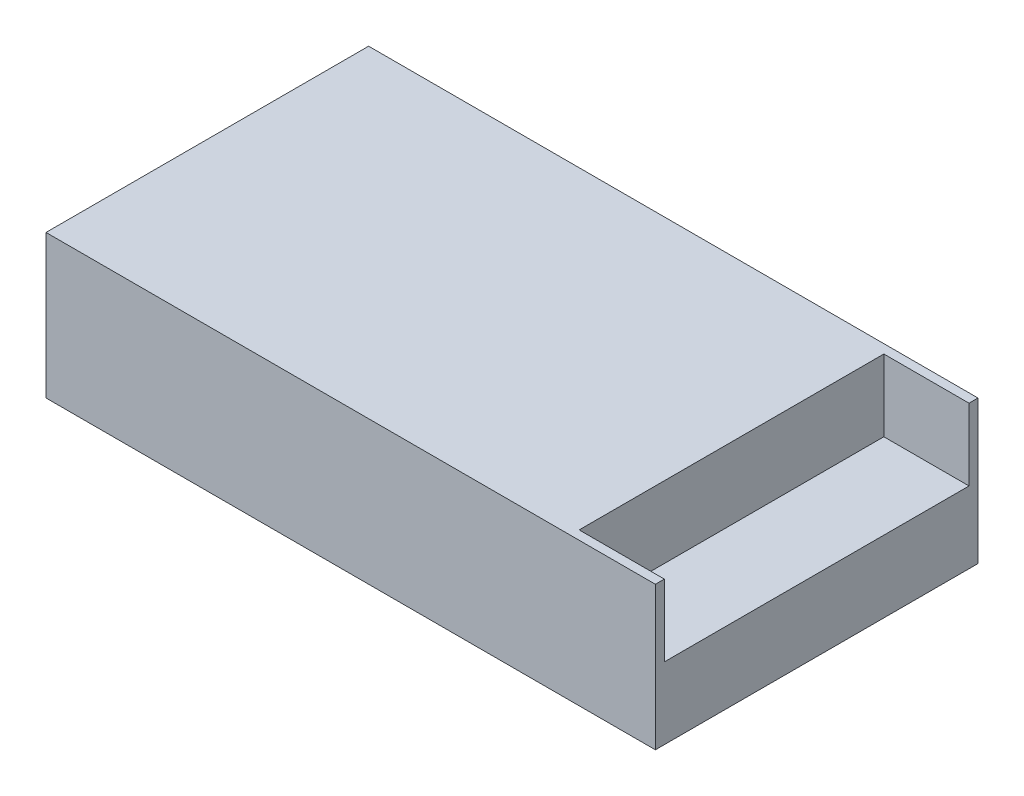
ISO-10303-21;
HEADER;
FILE_DESCRIPTION(('STEP AP214'),'2;1');
FILE_NAME('part.step','',(''),(''),'','','');
FILE_SCHEMA(('AUTOMOTIVE_DESIGN { 1 0 10303 214 1 1 1 1 }'));
ENDSEC;
DATA;
#1=APPLICATION_CONTEXT('core data for automotive mechanical design processes');
#2=APPLICATION_PROTOCOL_DEFINITION('international standard','automotive_design',2000,#1);
#3=PRODUCT_CONTEXT('',#1,'mechanical');
#4=PRODUCT('Part','Part','',(#3));
#5=PRODUCT_RELATED_PRODUCT_CATEGORY('part','',(#4));
#6=PRODUCT_DEFINITION_FORMATION('','',#4);
#7=PRODUCT_DEFINITION_CONTEXT('part definition',#1,'design');
#8=PRODUCT_DEFINITION('design','',#6,#7);
#9=PRODUCT_DEFINITION_SHAPE('','',#8);
#10=(LENGTH_UNIT() NAMED_UNIT(*) SI_UNIT(.MILLI.,.METRE.));
#11=(NAMED_UNIT(*) PLANE_ANGLE_UNIT() SI_UNIT($,.RADIAN.));
#12=(NAMED_UNIT(*) SI_UNIT($,.STERADIAN.) SOLID_ANGLE_UNIT());
#13=UNCERTAINTY_MEASURE_WITH_UNIT(LENGTH_MEASURE(1.E-05),#10,'distance_accuracy_value','');
#14=(GEOMETRIC_REPRESENTATION_CONTEXT(3) GLOBAL_UNCERTAINTY_ASSIGNED_CONTEXT((#13)) GLOBAL_UNIT_ASSIGNED_CONTEXT((#10,
#11,#12)) REPRESENTATION_CONTEXT('',''));
#15=CARTESIAN_POINT('',(0.,0.,0.));
#16=DIRECTION('',(0.,0.,1.));
#17=DIRECTION('',(1.,0.,0.));
#18=AXIS2_PLACEMENT_3D('',#15,#16,#17);
#19=CARTESIAN_POINT('',(0.,50.8,0.));
#20=DIRECTION('',(1.,0.,0.));
#21=DIRECTION('',(0.,0.,-1.));
#22=AXIS2_PLACEMENT_3D('',#19,#20,#21);
#23=PLANE('',#22);
#24=DIRECTION('',(0.,0.,1.));
#25=VECTOR('',#24,1.);
#26=CARTESIAN_POINT('',(0.,0.,0.));
#27=LINE('',#26,#25);
#28=CARTESIAN_POINT('',(0.,0.,-114.3));
#29=VERTEX_POINT('',#28);
#30=CARTESIAN_POINT('',(0.,0.,0.));
#31=VERTEX_POINT('',#30);
#32=EDGE_CURVE('E158',#29,#31,#27,.T.);
#33=ORIENTED_EDGE('',*,*,#32,.T.);
#34=DIRECTION('',(0.,-1.,0.));
#35=VECTOR('',#34,1.);
#36=CARTESIAN_POINT('',(0.,50.8,0.));
#37=LINE('',#36,#35);
#38=CARTESIAN_POINT('',(0.,50.8,0.));
#39=VERTEX_POINT('',#38);
#40=EDGE_CURVE('E11',#39,#31,#37,.T.);
#41=ORIENTED_EDGE('',*,*,#40,.F.);
#42=DIRECTION('',(0.,0.,1.));
#43=VECTOR('',#42,1.);
#44=CARTESIAN_POINT('',(0.,50.8,0.));
#45=LINE('',#44,#43);
#46=CARTESIAN_POINT('',(0.,50.8,-114.3));
#47=VERTEX_POINT('',#46);
#48=EDGE_CURVE('E146',#47,#39,#45,.T.);
#49=ORIENTED_EDGE('',*,*,#48,.F.);
#50=DIRECTION('',(0.,-1.,0.));
#51=VECTOR('',#50,1.);
#52=CARTESIAN_POINT('',(0.,50.8,-114.3));
#53=LINE('',#52,#51);
#54=EDGE_CURVE('E157',#47,#29,#53,.T.);
#55=ORIENTED_EDGE('',*,*,#54,.T.);
#56=EDGE_LOOP('',(#33,#41,#49,#55));
#57=FACE_BOUND('',#56,.T.);
#58=ADVANCED_FACE('F39',(#57),#23,.F.);
#59=CARTESIAN_POINT('',(0.,50.8,0.));
#60=DIRECTION('',(0.,0.,-1.));
#61=DIRECTION('',(-1.,0.,0.));
#62=AXIS2_PLACEMENT_3D('',#59,#60,#61);
#63=PLANE('',#62);
#64=DIRECTION('',(1.,0.,0.));
#65=VECTOR('',#64,1.);
#66=CARTESIAN_POINT('',(0.,0.,0.));
#67=LINE('',#66,#65);
#68=CARTESIAN_POINT('',(215.9,0.,0.));
#69=VERTEX_POINT('',#68);
#70=EDGE_CURVE('E162',#31,#69,#67,.T.);
#71=ORIENTED_EDGE('',*,*,#70,.T.);
#72=DIRECTION('',(0.,-1.,0.));
#73=VECTOR('',#72,1.);
#74=CARTESIAN_POINT('',(215.9,50.8,0.));
#75=LINE('',#74,#73);
#76=CARTESIAN_POINT('',(215.9,50.8,0.));
#77=VERTEX_POINT('',#76);
#78=EDGE_CURVE('E47',#77,#69,#75,.T.);
#79=ORIENTED_EDGE('',*,*,#78,.F.);
#80=DIRECTION('',(1.,0.,0.));
#81=VECTOR('',#80,1.);
#82=CARTESIAN_POINT('',(0.,50.8,0.));
#83=LINE('',#82,#81);
#84=EDGE_CURVE('E91',#39,#77,#83,.T.);
#85=ORIENTED_EDGE('',*,*,#84,.F.);
#86=ORIENTED_EDGE('',*,*,#40,.T.);
#87=EDGE_LOOP('',(#71,#79,#85,#86));
#88=FACE_BOUND('',#87,.T.);
#89=ADVANCED_FACE('F194',(#88),#63,.F.);
#90=CARTESIAN_POINT('',(215.9,50.8,0.));
#91=DIRECTION('',(-1.,0.,0.));
#92=DIRECTION('',(0.,0.,1.));
#93=AXIS2_PLACEMENT_3D('',#90,#91,#92);
#94=PLANE('',#93);
#95=DIRECTION('',(0.,0.,-1.));
#96=VECTOR('',#95,1.);
#97=CARTESIAN_POINT('',(215.9,25.4,-111.125));
#98=LINE('',#97,#96);
#99=CARTESIAN_POINT('',(215.9,25.4,-3.175));
#100=VERTEX_POINT('',#99);
#101=CARTESIAN_POINT('',(215.9,25.4,-111.125));
#102=VERTEX_POINT('',#101);
#103=EDGE_CURVE('E121',#100,#102,#98,.T.);
#104=ORIENTED_EDGE('',*,*,#103,.F.);
#105=DIRECTION('',(0.,1.,0.));
#106=VECTOR('',#105,1.);
#107=CARTESIAN_POINT('',(215.9,25.4,-3.175));
#108=LINE('',#107,#106);
#109=CARTESIAN_POINT('',(215.9,50.8,-3.175));
#110=VERTEX_POINT('',#109);
#111=EDGE_CURVE('E163',#100,#110,#108,.T.);
#112=ORIENTED_EDGE('',*,*,#111,.T.);
#113=DIRECTION('',(0.,0.,-1.));
#114=VECTOR('',#113,1.);
#115=CARTESIAN_POINT('',(215.9,50.8,0.));
#116=LINE('',#115,#114);
#117=EDGE_CURVE('E151',#77,#110,#116,.T.);
#118=ORIENTED_EDGE('',*,*,#117,.F.);
#119=ORIENTED_EDGE('',*,*,#78,.T.);
#120=DIRECTION('',(0.,0.,-1.));
#121=VECTOR('',#120,1.);
#122=CARTESIAN_POINT('',(215.9,0.,0.));
#123=LINE('',#122,#121);
#124=CARTESIAN_POINT('',(215.9,0.,-114.3));
#125=VERTEX_POINT('',#124);
#126=EDGE_CURVE('E166',#69,#125,#123,.T.);
#127=ORIENTED_EDGE('',*,*,#126,.T.);
#128=DIRECTION('',(0.,-1.,0.));
#129=VECTOR('',#128,1.);
#130=CARTESIAN_POINT('',(215.9,50.8,-114.3));
#131=LINE('',#130,#129);
#132=CARTESIAN_POINT('',(215.9,50.8,-114.3));
#133=VERTEX_POINT('',#132);
#134=EDGE_CURVE('E173',#133,#125,#131,.T.);
#135=ORIENTED_EDGE('',*,*,#134,.F.);
#136=CARTESIAN_POINT('',(215.9,50.8,-111.125));
#137=VERTEX_POINT('',#136);
#138=EDGE_CURVE('E136',#137,#133,#116,.T.);
#139=ORIENTED_EDGE('',*,*,#138,.F.);
#140=DIRECTION('',(0.,1.,0.));
#141=VECTOR('',#140,1.);
#142=CARTESIAN_POINT('',(215.9,25.4,-111.125));
#143=LINE('',#142,#141);
#144=EDGE_CURVE('E54',#102,#137,#143,.T.);
#145=ORIENTED_EDGE('',*,*,#144,.F.);
#146=EDGE_LOOP('',(#104,#112,#118,#119,#127,#135,#139,#145));
#147=FACE_BOUND('',#146,.T.);
#148=ADVANCED_FACE('F134',(#147),#94,.F.);
#149=CARTESIAN_POINT('',(0.,50.8,-114.3));
#150=DIRECTION('',(0.,0.,1.));
#151=DIRECTION('',(1.,0.,0.));
#152=AXIS2_PLACEMENT_3D('',#149,#150,#151);
#153=PLANE('',#152);
#154=DIRECTION('',(-1.,0.,0.));
#155=VECTOR('',#154,1.);
#156=CARTESIAN_POINT('',(0.,0.,-114.3));
#157=LINE('',#156,#155);
#158=EDGE_CURVE('E84',#125,#29,#157,.T.);
#159=ORIENTED_EDGE('',*,*,#158,.T.);
#160=ORIENTED_EDGE('',*,*,#54,.F.);
#161=DIRECTION('',(-1.,0.,0.));
#162=VECTOR('',#161,1.);
#163=CARTESIAN_POINT('',(0.,50.8,-114.3));
#164=LINE('',#163,#162);
#165=EDGE_CURVE('E63',#133,#47,#164,.T.);
#166=ORIENTED_EDGE('',*,*,#165,.F.);
#167=ORIENTED_EDGE('',*,*,#134,.T.);
#168=EDGE_LOOP('',(#159,#160,#166,#167));
#169=FACE_BOUND('',#168,.T.);
#170=ADVANCED_FACE('F185',(#169),#153,.F.);
#171=CARTESIAN_POINT('',(0.,50.8,0.));
#172=DIRECTION('',(0.,-1.,0.));
#173=DIRECTION('',(0.,0.,-1.));
#174=AXIS2_PLACEMENT_3D('',#171,#172,#173);
#175=PLANE('',#174);
#176=ORIENTED_EDGE('',*,*,#117,.T.);
#177=DIRECTION('',(1.,0.,0.));
#178=VECTOR('',#177,1.);
#179=CARTESIAN_POINT('',(215.9,50.8,-3.175));
#180=LINE('',#179,#178);
#181=CARTESIAN_POINT('',(185.71892836664,50.8,-3.175));
#182=VERTEX_POINT('',#181);
#183=EDGE_CURVE('E131',#182,#110,#180,.T.);
#184=ORIENTED_EDGE('',*,*,#183,.F.);
#185=DIRECTION('',(0.,0.,1.));
#186=VECTOR('',#185,1.);
#187=CARTESIAN_POINT('',(185.71892836664,50.8,-111.125));
#188=LINE('',#187,#186);
#189=CARTESIAN_POINT('',(185.71892836664,50.8,-111.125));
#190=VERTEX_POINT('',#189);
#191=EDGE_CURVE('E261',#190,#182,#188,.T.);
#192=ORIENTED_EDGE('',*,*,#191,.F.);
#193=DIRECTION('',(-1.,0.,0.));
#194=VECTOR('',#193,1.);
#195=CARTESIAN_POINT('',(215.9,50.8,-111.125));
#196=LINE('',#195,#194);
#197=EDGE_CURVE('E264',#137,#190,#196,.T.);
#198=ORIENTED_EDGE('',*,*,#197,.F.);
#199=ORIENTED_EDGE('',*,*,#138,.T.);
#200=ORIENTED_EDGE('',*,*,#165,.T.);
#201=ORIENTED_EDGE('',*,*,#48,.T.);
#202=ORIENTED_EDGE('',*,*,#84,.T.);
#203=EDGE_LOOP('',(#176,#184,#192,#198,#199,#200,#201,#202));
#204=FACE_BOUND('',#203,.T.);
#205=ADVANCED_FACE('F187',(#204),#175,.F.);
#206=CARTESIAN_POINT('',(0.,0.,0.));
#207=DIRECTION('',(0.,-1.,0.));
#208=DIRECTION('',(0.,0.,-1.));
#209=AXIS2_PLACEMENT_3D('',#206,#207,#208);
#210=PLANE('',#209);
#211=ORIENTED_EDGE('',*,*,#32,.F.);
#212=ORIENTED_EDGE('',*,*,#158,.F.);
#213=ORIENTED_EDGE('',*,*,#126,.F.);
#214=ORIENTED_EDGE('',*,*,#70,.F.);
#215=EDGE_LOOP('',(#211,#212,#213,#214));
#216=FACE_BOUND('',#215,.T.);
#217=ADVANCED_FACE('F181',(#216),#210,.T.);
#218=CARTESIAN_POINT('',(215.9,25.4,-3.175));
#219=DIRECTION('',(0.,0.,1.));
#220=DIRECTION('',(1.,0.,0.));
#221=AXIS2_PLACEMENT_3D('',#218,#219,#220);
#222=PLANE('',#221);
#223=ORIENTED_EDGE('',*,*,#183,.T.);
#224=ORIENTED_EDGE('',*,*,#111,.F.);
#225=DIRECTION('',(1.,0.,0.));
#226=VECTOR('',#225,1.);
#227=CARTESIAN_POINT('',(215.9,25.4,-3.175));
#228=LINE('',#227,#226);
#229=CARTESIAN_POINT('',(185.71892836664,25.4,-3.175));
#230=VERTEX_POINT('',#229);
#231=EDGE_CURVE('E127',#230,#100,#228,.T.);
#232=ORIENTED_EDGE('',*,*,#231,.F.);
#233=DIRECTION('',(0.,1.,0.));
#234=VECTOR('',#233,1.);
#235=CARTESIAN_POINT('',(185.71892836664,25.4,-3.175));
#236=LINE('',#235,#234);
#237=EDGE_CURVE('E141',#230,#182,#236,.T.);
#238=ORIENTED_EDGE('',*,*,#237,.T.);
#239=EDGE_LOOP('',(#223,#224,#232,#238));
#240=FACE_BOUND('',#239,.T.);
#241=ADVANCED_FACE('F223',(#240),#222,.F.);
#242=CARTESIAN_POINT('',(185.71892836664,25.4,-111.125));
#243=DIRECTION('',(-1.,0.,0.));
#244=DIRECTION('',(0.,0.,1.));
#245=AXIS2_PLACEMENT_3D('',#242,#243,#244);
#246=PLANE('',#245);
#247=ORIENTED_EDGE('',*,*,#191,.T.);
#248=ORIENTED_EDGE('',*,*,#237,.F.);
#249=DIRECTION('',(0.,0.,1.));
#250=VECTOR('',#249,1.);
#251=CARTESIAN_POINT('',(185.71892836664,25.4,-111.125));
#252=LINE('',#251,#250);
#253=CARTESIAN_POINT('',(185.71892836664,25.4,-111.125));
#254=VERTEX_POINT('',#253);
#255=EDGE_CURVE('E120',#254,#230,#252,.T.);
#256=ORIENTED_EDGE('',*,*,#255,.F.);
#257=DIRECTION('',(0.,1.,0.));
#258=VECTOR('',#257,1.);
#259=CARTESIAN_POINT('',(185.71892836664,25.4,-111.125));
#260=LINE('',#259,#258);
#261=EDGE_CURVE('E115',#254,#190,#260,.T.);
#262=ORIENTED_EDGE('',*,*,#261,.T.);
#263=EDGE_LOOP('',(#247,#248,#256,#262));
#264=FACE_BOUND('',#263,.T.);
#265=ADVANCED_FACE('F228',(#264),#246,.F.);
#266=CARTESIAN_POINT('',(215.9,25.4,-111.125));
#267=DIRECTION('',(0.,0.,-1.));
#268=DIRECTION('',(-1.,0.,0.));
#269=AXIS2_PLACEMENT_3D('',#266,#267,#268);
#270=PLANE('',#269);
#271=ORIENTED_EDGE('',*,*,#197,.T.);
#272=ORIENTED_EDGE('',*,*,#261,.F.);
#273=DIRECTION('',(-1.,0.,0.));
#274=VECTOR('',#273,1.);
#275=CARTESIAN_POINT('',(215.9,25.4,-111.125));
#276=LINE('',#275,#274);
#277=EDGE_CURVE('E112',#102,#254,#276,.T.);
#278=ORIENTED_EDGE('',*,*,#277,.F.);
#279=ORIENTED_EDGE('',*,*,#144,.T.);
#280=EDGE_LOOP('',(#271,#272,#278,#279));
#281=FACE_BOUND('',#280,.T.);
#282=ADVANCED_FACE('F114',(#281),#270,.F.);
#283=CARTESIAN_POINT('',(0.,25.4,0.));
#284=DIRECTION('',(0.,-1.,0.));
#285=DIRECTION('',(0.,0.,-1.));
#286=AXIS2_PLACEMENT_3D('',#283,#284,#285);
#287=PLANE('',#286);
#288=ORIENTED_EDGE('',*,*,#103,.T.);
#289=ORIENTED_EDGE('',*,*,#277,.T.);
#290=ORIENTED_EDGE('',*,*,#255,.T.);
#291=ORIENTED_EDGE('',*,*,#231,.T.);
#292=EDGE_LOOP('',(#288,#289,#290,#291));
#293=FACE_BOUND('',#292,.T.);
#294=ADVANCED_FACE('F125',(#293),#287,.F.);
#295=CLOSED_SHELL('',(#58,#89,#148,#170,#205,#217,#241,#265,#282,#294));
#296=MANIFOLD_SOLID_BREP('B2',#295);
#297=ADVANCED_BREP_SHAPE_REPRESENTATION('',(#18,#296),#14);
#298=SHAPE_DEFINITION_REPRESENTATION(#9,#297);
ENDSEC;
END-ISO-10303-21;
